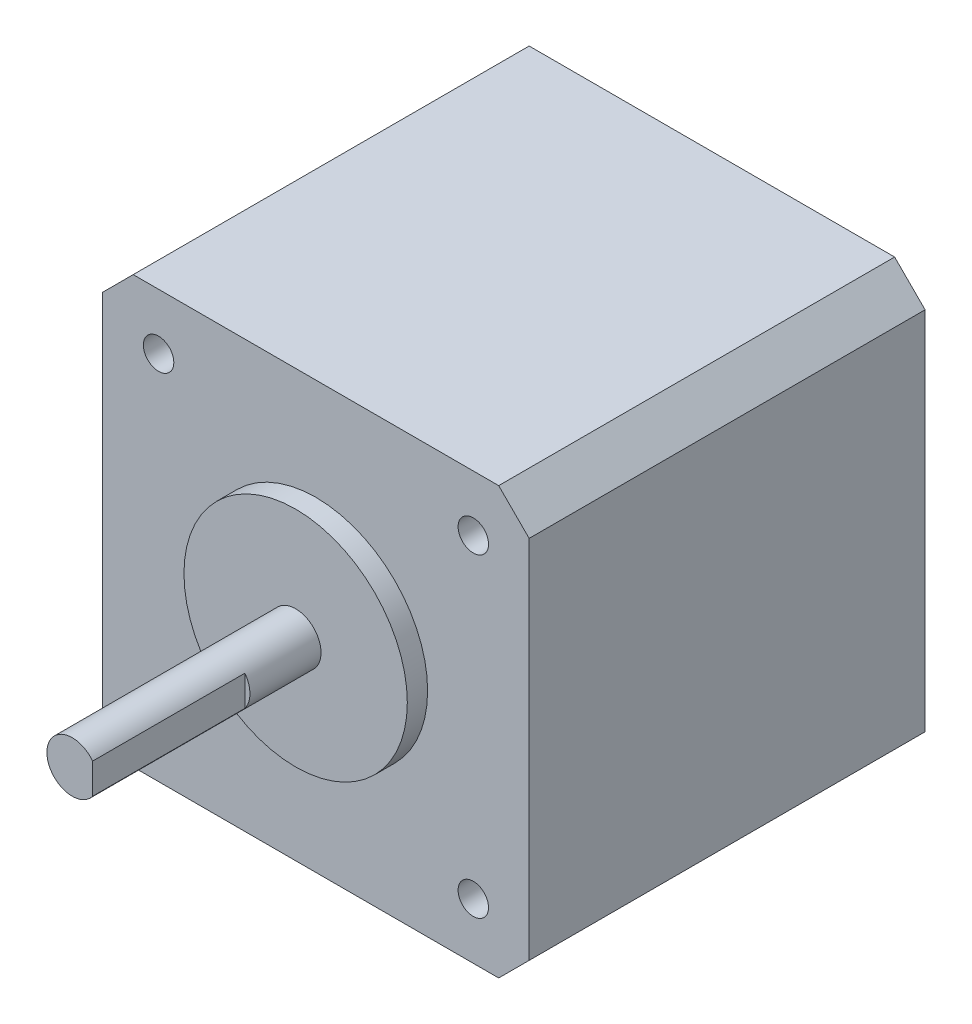
ISO-10303-21;
HEADER;
FILE_DESCRIPTION(('STEP AP214'),'2;1');
FILE_NAME('part.step','',(''),(''),'','','');
FILE_SCHEMA(('AUTOMOTIVE_DESIGN { 1 0 10303 214 1 1 1 1 }'));
ENDSEC;
DATA;
#1=APPLICATION_CONTEXT('core data for automotive mechanical design processes');
#2=APPLICATION_PROTOCOL_DEFINITION('international standard','automotive_design',2000,#1);
#3=PRODUCT_CONTEXT('',#1,'mechanical');
#4=PRODUCT('Part','Part','',(#3));
#5=PRODUCT_RELATED_PRODUCT_CATEGORY('part','',(#4));
#6=PRODUCT_DEFINITION_FORMATION('','',#4);
#7=PRODUCT_DEFINITION_CONTEXT('part definition',#1,'design');
#8=PRODUCT_DEFINITION('design','',#6,#7);
#9=PRODUCT_DEFINITION_SHAPE('','',#8);
#10=(LENGTH_UNIT() NAMED_UNIT(*) SI_UNIT(.MILLI.,.METRE.));
#11=(NAMED_UNIT(*) PLANE_ANGLE_UNIT() SI_UNIT($,.RADIAN.));
#12=(NAMED_UNIT(*) SI_UNIT($,.STERADIAN.) SOLID_ANGLE_UNIT());
#13=UNCERTAINTY_MEASURE_WITH_UNIT(LENGTH_MEASURE(1.E-05),#10,'distance_accuracy_value','');
#14=(GEOMETRIC_REPRESENTATION_CONTEXT(3) GLOBAL_UNCERTAINTY_ASSIGNED_CONTEXT((#13)) GLOBAL_UNIT_ASSIGNED_CONTEXT((#10,
#11,#12)) REPRESENTATION_CONTEXT('',''));
#15=CARTESIAN_POINT('',(0.,0.,0.));
#16=DIRECTION('',(0.,0.,1.));
#17=DIRECTION('',(1.,0.,0.));
#18=AXIS2_PLACEMENT_3D('',#15,#16,#17);
#19=CARTESIAN_POINT('',(21.,21.,63.));
#20=DIRECTION('',(0.,0.,-1.));
#21=DIRECTION('',(-1.,0.,0.));
#22=AXIS2_PLACEMENT_3D('',#19,#20,#21);
#23=CYLINDRICAL_SURFACE('',#22,2.5);
#24=CARTESIAN_POINT('',(21.,21.,41.));
#25=DIRECTION('',(0.,0.,1.));
#26=DIRECTION('',(1.,0.,0.));
#27=AXIS2_PLACEMENT_3D('',#24,#25,#26);
#28=CIRCLE('',#27,2.5);
#29=CARTESIAN_POINT('',(23.5,21.,41.));
#30=VERTEX_POINT('',#29);
#31=EDGE_CURVE('E156',#30,#30,#28,.T.);
#32=ORIENTED_EDGE('',*,*,#31,.T.);
#33=EDGE_LOOP('',(#32));
#34=FACE_BOUND('',#33,.T.);
#35=DIRECTION('',(0.,0.,-1.));
#36=VECTOR('',#35,1.);
#37=CARTESIAN_POINT('',(23.,19.5,249.981522672464));
#38=LINE('',#37,#36);
#39=CARTESIAN_POINT('',(23.,19.5,63.));
#40=VERTEX_POINT('',#39);
#41=CARTESIAN_POINT('',(23.,19.5,48.));
#42=VERTEX_POINT('',#41);
#43=EDGE_CURVE('E116',#40,#42,#38,.T.);
#44=ORIENTED_EDGE('',*,*,#43,.F.);
#45=CARTESIAN_POINT('',(21.,21.,63.));
#46=DIRECTION('',(0.,0.,1.));
#47=DIRECTION('',(1.,0.,0.));
#48=AXIS2_PLACEMENT_3D('',#45,#46,#47);
#49=CIRCLE('',#48,2.5);
#50=CARTESIAN_POINT('',(23.,22.5,63.));
#51=VERTEX_POINT('',#50);
#52=EDGE_CURVE('E151',#51,#40,#49,.T.);
#53=ORIENTED_EDGE('',*,*,#52,.F.);
#54=DIRECTION('',(0.,0.,-1.));
#55=VECTOR('',#54,1.);
#56=CARTESIAN_POINT('',(23.,22.5,249.981522672464));
#57=LINE('',#56,#55);
#58=CARTESIAN_POINT('',(23.,22.5,48.));
#59=VERTEX_POINT('',#58);
#60=EDGE_CURVE('E48',#51,#59,#57,.T.);
#61=ORIENTED_EDGE('',*,*,#60,.T.);
#62=CARTESIAN_POINT('',(21.,21.,48.));
#63=DIRECTION('',(0.,0.,1.));
#64=DIRECTION('',(1.,0.,0.));
#65=AXIS2_PLACEMENT_3D('',#62,#63,#64);
#66=CIRCLE('',#65,2.5);
#67=EDGE_CURVE('E115',#42,#59,#66,.T.);
#68=ORIENTED_EDGE('',*,*,#67,.F.);
#69=EDGE_LOOP('',(#44,#53,#61,#68));
#70=FACE_BOUND('',#69,.T.);
#71=ADVANCED_FACE('F33',(#34,#70),#23,.T.);
#72=CARTESIAN_POINT('',(21.,21.,63.));
#73=DIRECTION('',(0.,0.,1.));
#74=DIRECTION('',(1.,0.,0.));
#75=AXIS2_PLACEMENT_3D('',#72,#73,#74);
#76=PLANE('',#75);
#77=ORIENTED_EDGE('',*,*,#52,.T.);
#78=DIRECTION('',(0.,-1.,0.));
#79=VECTOR('',#78,1.);
#80=CARTESIAN_POINT('',(23.,22.5,63.));
#81=LINE('',#80,#79);
#82=EDGE_CURVE('E120',#51,#40,#81,.T.);
#83=ORIENTED_EDGE('',*,*,#82,.F.);
#84=EDGE_LOOP('',(#77,#83));
#85=FACE_BOUND('',#84,.T.);
#86=ADVANCED_FACE('F259',(#85),#76,.T.);
#87=CARTESIAN_POINT('',(0.,0.,39.));
#88=DIRECTION('',(1.,0.,0.));
#89=DIRECTION('',(0.,0.,-1.));
#90=AXIS2_PLACEMENT_3D('',#87,#88,#89);
#91=PLANE('',#90);
#92=DIRECTION('',(0.,-1.,0.));
#93=VECTOR('',#92,1.);
#94=CARTESIAN_POINT('',(0.,0.,0.));
#95=LINE('',#94,#93);
#96=CARTESIAN_POINT('',(0.,39.,0.));
#97=VERTEX_POINT('',#96);
#98=CARTESIAN_POINT('',(0.,3.00000000000001,0.));
#99=VERTEX_POINT('',#98);
#100=EDGE_CURVE('E163',#97,#99,#95,.T.);
#101=ORIENTED_EDGE('',*,*,#100,.T.);
#102=DIRECTION('',(0.,0.,1.));
#103=VECTOR('',#102,1.);
#104=CARTESIAN_POINT('',(0.,3.00000000000001,39.));
#105=LINE('',#104,#103);
#106=CARTESIAN_POINT('',(0.,3.00000000000001,39.));
#107=VERTEX_POINT('',#106);
#108=EDGE_CURVE('E202',#99,#107,#105,.T.);
#109=ORIENTED_EDGE('',*,*,#108,.T.);
#110=DIRECTION('',(0.,-1.,0.));
#111=VECTOR('',#110,1.);
#112=CARTESIAN_POINT('',(0.,0.,39.));
#113=LINE('',#112,#111);
#114=CARTESIAN_POINT('',(0.,39.,39.));
#115=VERTEX_POINT('',#114);
#116=EDGE_CURVE('E167',#115,#107,#113,.T.);
#117=ORIENTED_EDGE('',*,*,#116,.F.);
#118=DIRECTION('',(0.,0.,-1.));
#119=VECTOR('',#118,1.);
#120=CARTESIAN_POINT('',(0.,39.,39.));
#121=LINE('',#120,#119);
#122=EDGE_CURVE('E199',#115,#97,#121,.T.);
#123=ORIENTED_EDGE('',*,*,#122,.T.);
#124=EDGE_LOOP('',(#101,#109,#117,#123));
#125=FACE_BOUND('',#124,.T.);
#126=ADVANCED_FACE('F239',(#125),#91,.F.);
#127=CARTESIAN_POINT('',(0.,0.,39.));
#128=DIRECTION('',(0.,1.,0.));
#129=DIRECTION('',(0.,0.,1.));
#130=AXIS2_PLACEMENT_3D('',#127,#128,#129);
#131=PLANE('',#130);
#132=DIRECTION('',(1.,0.,0.));
#133=VECTOR('',#132,1.);
#134=CARTESIAN_POINT('',(0.,0.,39.));
#135=LINE('',#134,#133);
#136=CARTESIAN_POINT('',(3.,0.,39.));
#137=VERTEX_POINT('',#136);
#138=CARTESIAN_POINT('',(39.,0.,39.));
#139=VERTEX_POINT('',#138);
#140=EDGE_CURVE('E170',#137,#139,#135,.T.);
#141=ORIENTED_EDGE('',*,*,#140,.F.);
#142=DIRECTION('',(0.,0.,-1.));
#143=VECTOR('',#142,1.);
#144=CARTESIAN_POINT('',(3.,0.,39.));
#145=LINE('',#144,#143);
#146=CARTESIAN_POINT('',(3.,0.,0.));
#147=VERTEX_POINT('',#146);
#148=EDGE_CURVE('E188',#137,#147,#145,.T.);
#149=ORIENTED_EDGE('',*,*,#148,.T.);
#150=DIRECTION('',(1.,0.,0.));
#151=VECTOR('',#150,1.);
#152=CARTESIAN_POINT('',(0.,0.,0.));
#153=LINE('',#152,#151);
#154=CARTESIAN_POINT('',(39.,0.,0.));
#155=VERTEX_POINT('',#154);
#156=EDGE_CURVE('E180',#147,#155,#153,.T.);
#157=ORIENTED_EDGE('',*,*,#156,.T.);
#158=DIRECTION('',(0.,0.,1.));
#159=VECTOR('',#158,1.);
#160=CARTESIAN_POINT('',(39.,0.,39.));
#161=LINE('',#160,#159);
#162=EDGE_CURVE('E159',#155,#139,#161,.T.);
#163=ORIENTED_EDGE('',*,*,#162,.T.);
#164=EDGE_LOOP('',(#141,#149,#157,#163));
#165=FACE_BOUND('',#164,.T.);
#166=ADVANCED_FACE('F247',(#165),#131,.F.);
#167=CARTESIAN_POINT('',(42.,0.,39.));
#168=DIRECTION('',(-1.,0.,0.));
#169=DIRECTION('',(0.,0.,1.));
#170=AXIS2_PLACEMENT_3D('',#167,#168,#169);
#171=PLANE('',#170);
#172=DIRECTION('',(0.,1.,0.));
#173=VECTOR('',#172,1.);
#174=CARTESIAN_POINT('',(42.,0.,39.));
#175=LINE('',#174,#173);
#176=CARTESIAN_POINT('',(42.,3.,39.));
#177=VERTEX_POINT('',#176);
#178=CARTESIAN_POINT('',(42.,39.,39.));
#179=VERTEX_POINT('',#178);
#180=EDGE_CURVE('E174',#177,#179,#175,.T.);
#181=ORIENTED_EDGE('',*,*,#180,.F.);
#182=DIRECTION('',(0.,0.,-1.));
#183=VECTOR('',#182,1.);
#184=CARTESIAN_POINT('',(42.,3.,39.));
#185=LINE('',#184,#183);
#186=CARTESIAN_POINT('',(42.,3.,0.));
#187=VERTEX_POINT('',#186);
#188=EDGE_CURVE('E11',#177,#187,#185,.T.);
#189=ORIENTED_EDGE('',*,*,#188,.T.);
#190=DIRECTION('',(0.,1.,0.));
#191=VECTOR('',#190,1.);
#192=CARTESIAN_POINT('',(42.,0.,0.));
#193=LINE('',#192,#191);
#194=CARTESIAN_POINT('',(42.,39.,0.));
#195=VERTEX_POINT('',#194);
#196=EDGE_CURVE('E183',#187,#195,#193,.T.);
#197=ORIENTED_EDGE('',*,*,#196,.T.);
#198=DIRECTION('',(0.,0.,1.));
#199=VECTOR('',#198,1.);
#200=CARTESIAN_POINT('',(42.,39.,39.));
#201=LINE('',#200,#199);
#202=EDGE_CURVE('E41',#195,#179,#201,.T.);
#203=ORIENTED_EDGE('',*,*,#202,.T.);
#204=EDGE_LOOP('',(#181,#189,#197,#203));
#205=FACE_BOUND('',#204,.T.);
#206=ADVANCED_FACE('F218',(#205),#171,.F.);
#207=CARTESIAN_POINT('',(0.,42.,39.));
#208=DIRECTION('',(0.,-1.,0.));
#209=DIRECTION('',(0.,0.,-1.));
#210=AXIS2_PLACEMENT_3D('',#207,#208,#209);
#211=PLANE('',#210);
#212=DIRECTION('',(-1.,0.,0.));
#213=VECTOR('',#212,1.);
#214=CARTESIAN_POINT('',(0.,42.,0.));
#215=LINE('',#214,#213);
#216=CARTESIAN_POINT('',(39.,42.,0.));
#217=VERTEX_POINT('',#216);
#218=CARTESIAN_POINT('',(3.00000000000002,42.,0.));
#219=VERTEX_POINT('',#218);
#220=EDGE_CURVE('E171',#217,#219,#215,.T.);
#221=ORIENTED_EDGE('',*,*,#220,.T.);
#222=DIRECTION('',(0.,0.,1.));
#223=VECTOR('',#222,1.);
#224=CARTESIAN_POINT('',(3.00000000000002,42.,39.));
#225=LINE('',#224,#223);
#226=CARTESIAN_POINT('',(3.00000000000002,42.,39.));
#227=VERTEX_POINT('',#226);
#228=EDGE_CURVE('E56',#219,#227,#225,.T.);
#229=ORIENTED_EDGE('',*,*,#228,.T.);
#230=DIRECTION('',(-1.,0.,0.));
#231=VECTOR('',#230,1.);
#232=CARTESIAN_POINT('',(0.,42.,39.));
#233=LINE('',#232,#231);
#234=CARTESIAN_POINT('',(39.,42.,39.));
#235=VERTEX_POINT('',#234);
#236=EDGE_CURVE('E166',#235,#227,#233,.T.);
#237=ORIENTED_EDGE('',*,*,#236,.F.);
#238=DIRECTION('',(0.,0.,-1.));
#239=VECTOR('',#238,1.);
#240=CARTESIAN_POINT('',(39.,42.,39.));
#241=LINE('',#240,#239);
#242=EDGE_CURVE('E212',#235,#217,#241,.T.);
#243=ORIENTED_EDGE('',*,*,#242,.T.);
#244=EDGE_LOOP('',(#221,#229,#237,#243));
#245=FACE_BOUND('',#244,.T.);
#246=ADVANCED_FACE('F228',(#245),#211,.F.);
#247=CARTESIAN_POINT('',(0.,0.,39.));
#248=DIRECTION('',(0.,0.,-1.));
#249=DIRECTION('',(-1.,0.,0.));
#250=AXIS2_PLACEMENT_3D('',#247,#248,#249);
#251=PLANE('',#250);
#252=CARTESIAN_POINT('',(36.5,36.5,39.));
#253=DIRECTION('',(0.,0.,1.));
#254=DIRECTION('',(1.,0.,0.));
#255=AXIS2_PLACEMENT_3D('',#252,#253,#254);
#256=CIRCLE('',#255,1.5);
#257=CARTESIAN_POINT('',(38.,36.5,39.));
#258=VERTEX_POINT('',#257);
#259=EDGE_CURVE('E145',#258,#258,#256,.T.);
#260=ORIENTED_EDGE('',*,*,#259,.F.);
#261=EDGE_LOOP('',(#260));
#262=FACE_BOUND('',#261,.T.);
#263=CARTESIAN_POINT('',(36.5,5.5,39.));
#264=DIRECTION('',(0.,0.,1.));
#265=DIRECTION('',(1.,0.,0.));
#266=AXIS2_PLACEMENT_3D('',#263,#264,#265);
#267=CIRCLE('',#266,1.5);
#268=CARTESIAN_POINT('',(38.,5.5,39.));
#269=VERTEX_POINT('',#268);
#270=EDGE_CURVE('E139',#269,#269,#267,.T.);
#271=ORIENTED_EDGE('',*,*,#270,.F.);
#272=EDGE_LOOP('',(#271));
#273=FACE_BOUND('',#272,.T.);
#274=CARTESIAN_POINT('',(5.5,5.5,39.));
#275=DIRECTION('',(0.,0.,1.));
#276=DIRECTION('',(1.,0.,0.));
#277=AXIS2_PLACEMENT_3D('',#274,#275,#276);
#278=CIRCLE('',#277,1.5);
#279=CARTESIAN_POINT('',(7.,5.5,39.));
#280=VERTEX_POINT('',#279);
#281=EDGE_CURVE('E133',#280,#280,#278,.T.);
#282=ORIENTED_EDGE('',*,*,#281,.F.);
#283=EDGE_LOOP('',(#282));
#284=FACE_BOUND('',#283,.T.);
#285=CARTESIAN_POINT('',(5.5,36.5,39.));
#286=DIRECTION('',(0.,0.,1.));
#287=DIRECTION('',(1.,0.,0.));
#288=AXIS2_PLACEMENT_3D('',#285,#286,#287);
#289=CIRCLE('',#288,1.5);
#290=CARTESIAN_POINT('',(7.,36.5,39.));
#291=VERTEX_POINT('',#290);
#292=EDGE_CURVE('E132',#291,#291,#289,.T.);
#293=ORIENTED_EDGE('',*,*,#292,.F.);
#294=EDGE_LOOP('',(#293));
#295=FACE_BOUND('',#294,.T.);
#296=CARTESIAN_POINT('',(21.,21.,39.));
#297=DIRECTION('',(0.,0.,1.));
#298=DIRECTION('',(1.,0.,0.));
#299=AXIS2_PLACEMENT_3D('',#296,#297,#298);
#300=CIRCLE('',#299,11.);
#301=CARTESIAN_POINT('',(32.,21.,39.));
#302=VERTEX_POINT('',#301);
#303=EDGE_CURVE('E160',#302,#302,#300,.T.);
#304=ORIENTED_EDGE('',*,*,#303,.F.);
#305=EDGE_LOOP('',(#304));
#306=FACE_BOUND('',#305,.T.);
#307=ORIENTED_EDGE('',*,*,#116,.T.);
#308=DIRECTION('',(-0.707106781186547,0.707106781186548,0.));
#309=VECTOR('',#308,1.);
#310=CARTESIAN_POINT('',(3.,0.,39.));
#311=LINE('',#310,#309);
#312=EDGE_CURVE('E210',#107,#137,#311,.F.);
#313=ORIENTED_EDGE('',*,*,#312,.T.);
#314=ORIENTED_EDGE('',*,*,#140,.T.);
#315=DIRECTION('',(-0.707106781186548,-0.707106781186547,0.));
#316=VECTOR('',#315,1.);
#317=CARTESIAN_POINT('',(42.,3.,39.));
#318=LINE('',#317,#316);
#319=EDGE_CURVE('E206',#139,#177,#318,.F.);
#320=ORIENTED_EDGE('',*,*,#319,.T.);
#321=ORIENTED_EDGE('',*,*,#180,.T.);
#322=DIRECTION('',(0.707106781186546,-0.707106781186549,0.));
#323=VECTOR('',#322,1.);
#324=CARTESIAN_POINT('',(39.,42.,39.));
#325=LINE('',#324,#323);
#326=EDGE_CURVE('E204',#179,#235,#325,.F.);
#327=ORIENTED_EDGE('',*,*,#326,.T.);
#328=ORIENTED_EDGE('',*,*,#236,.T.);
#329=DIRECTION('',(0.707106781186549,0.707106781186546,0.));
#330=VECTOR('',#329,1.);
#331=CARTESIAN_POINT('',(0.,39.,39.));
#332=LINE('',#331,#330);
#333=EDGE_CURVE('E208',#227,#115,#332,.F.);
#334=ORIENTED_EDGE('',*,*,#333,.T.);
#335=EDGE_LOOP('',(#307,#313,#314,#320,#321,#327,#328,#334));
#336=FACE_BOUND('',#335,.T.);
#337=ADVANCED_FACE('F224',(#262,#273,#284,#295,#306,#336),#251,.F.);
#338=CARTESIAN_POINT('',(0.,0.,0.));
#339=DIRECTION('',(0.,0.,-1.));
#340=DIRECTION('',(-1.,0.,0.));
#341=AXIS2_PLACEMENT_3D('',#338,#339,#340);
#342=PLANE('',#341);
#343=ORIENTED_EDGE('',*,*,#156,.F.);
#344=DIRECTION('',(0.707106781186547,-0.707106781186548,0.));
#345=VECTOR('',#344,1.);
#346=CARTESIAN_POINT('',(1.5,1.5,0.));
#347=LINE('',#346,#345);
#348=EDGE_CURVE('E197',#147,#99,#347,.F.);
#349=ORIENTED_EDGE('',*,*,#348,.T.);
#350=ORIENTED_EDGE('',*,*,#100,.F.);
#351=DIRECTION('',(-0.707106781186549,-0.707106781186546,0.));
#352=VECTOR('',#351,1.);
#353=CARTESIAN_POINT('',(-19.5,19.5000000000001,0.));
#354=LINE('',#353,#352);
#355=EDGE_CURVE('E195',#97,#219,#354,.F.);
#356=ORIENTED_EDGE('',*,*,#355,.T.);
#357=ORIENTED_EDGE('',*,*,#220,.F.);
#358=DIRECTION('',(-0.707106781186546,0.707106781186549,0.));
#359=VECTOR('',#358,1.);
#360=CARTESIAN_POINT('',(40.5000000000001,40.4999999999999,0.));
#361=LINE('',#360,#359);
#362=EDGE_CURVE('E191',#217,#195,#361,.F.);
#363=ORIENTED_EDGE('',*,*,#362,.T.);
#364=ORIENTED_EDGE('',*,*,#196,.F.);
#365=DIRECTION('',(0.707106781186548,0.707106781186547,0.));
#366=VECTOR('',#365,1.);
#367=CARTESIAN_POINT('',(19.5,-19.5,0.));
#368=LINE('',#367,#366);
#369=EDGE_CURVE('E193',#187,#155,#368,.F.);
#370=ORIENTED_EDGE('',*,*,#369,.T.);
#371=EDGE_LOOP('',(#343,#349,#350,#356,#357,#363,#364,#370));
#372=FACE_BOUND('',#371,.T.);
#373=ADVANCED_FACE('F231',(#372),#342,.T.);
#374=CARTESIAN_POINT('',(21.,21.,41.));
#375=DIRECTION('',(0.,0.,-1.));
#376=DIRECTION('',(-1.,0.,0.));
#377=AXIS2_PLACEMENT_3D('',#374,#375,#376);
#378=CYLINDRICAL_SURFACE('',#377,11.);
#379=CARTESIAN_POINT('',(21.,21.,41.));
#380=DIRECTION('',(0.,0.,1.));
#381=DIRECTION('',(1.,0.,0.));
#382=AXIS2_PLACEMENT_3D('',#379,#380,#381);
#383=CIRCLE('',#382,11.);
#384=CARTESIAN_POINT('',(32.,21.,41.));
#385=VERTEX_POINT('',#384);
#386=EDGE_CURVE('E155',#385,#385,#383,.T.);
#387=ORIENTED_EDGE('',*,*,#386,.F.);
#388=EDGE_LOOP('',(#387));
#389=FACE_BOUND('',#388,.T.);
#390=ORIENTED_EDGE('',*,*,#303,.T.);
#391=EDGE_LOOP('',(#390));
#392=FACE_BOUND('',#391,.T.);
#393=ADVANCED_FACE('F273',(#389,#392),#378,.T.);
#394=CARTESIAN_POINT('',(21.,21.,41.));
#395=DIRECTION('',(0.,0.,1.));
#396=DIRECTION('',(1.,0.,0.));
#397=AXIS2_PLACEMENT_3D('',#394,#395,#396);
#398=PLANE('',#397);
#399=ORIENTED_EDGE('',*,*,#31,.F.);
#400=EDGE_LOOP('',(#399));
#401=FACE_BOUND('',#400,.T.);
#402=ORIENTED_EDGE('',*,*,#386,.T.);
#403=EDGE_LOOP('',(#402));
#404=FACE_BOUND('',#403,.T.);
#405=ADVANCED_FACE('F270',(#401,#404),#398,.T.);
#406=CARTESIAN_POINT('',(3.,0.,39.));
#407=DIRECTION('',(0.707106781186548,0.707106781186547,0.));
#408=DIRECTION('',(0.,0.,-1.));
#409=AXIS2_PLACEMENT_3D('',#406,#407,#408);
#410=PLANE('',#409);
#411=ORIENTED_EDGE('',*,*,#312,.F.);
#412=ORIENTED_EDGE('',*,*,#108,.F.);
#413=ORIENTED_EDGE('',*,*,#348,.F.);
#414=ORIENTED_EDGE('',*,*,#148,.F.);
#415=EDGE_LOOP('',(#411,#412,#413,#414));
#416=FACE_BOUND('',#415,.T.);
#417=ADVANCED_FACE('F245',(#416),#410,.F.);
#418=CARTESIAN_POINT('',(0.,39.,39.));
#419=DIRECTION('',(0.707106781186546,-0.707106781186549,0.));
#420=DIRECTION('',(0.,0.,-1.));
#421=AXIS2_PLACEMENT_3D('',#418,#419,#420);
#422=PLANE('',#421);
#423=ORIENTED_EDGE('',*,*,#333,.F.);
#424=ORIENTED_EDGE('',*,*,#228,.F.);
#425=ORIENTED_EDGE('',*,*,#355,.F.);
#426=ORIENTED_EDGE('',*,*,#122,.F.);
#427=EDGE_LOOP('',(#423,#424,#425,#426));
#428=FACE_BOUND('',#427,.T.);
#429=ADVANCED_FACE('F236',(#428),#422,.F.);
#430=CARTESIAN_POINT('',(42.,3.,39.));
#431=DIRECTION('',(-0.707106781186547,0.707106781186548,0.));
#432=DIRECTION('',(0.,0.,-1.));
#433=AXIS2_PLACEMENT_3D('',#430,#431,#432);
#434=PLANE('',#433);
#435=ORIENTED_EDGE('',*,*,#319,.F.);
#436=ORIENTED_EDGE('',*,*,#162,.F.);
#437=ORIENTED_EDGE('',*,*,#369,.F.);
#438=ORIENTED_EDGE('',*,*,#188,.F.);
#439=EDGE_LOOP('',(#435,#436,#437,#438));
#440=FACE_BOUND('',#439,.T.);
#441=ADVANCED_FACE('F250',(#440),#434,.F.);
#442=CARTESIAN_POINT('',(39.,42.,39.));
#443=DIRECTION('',(-0.707106781186549,-0.707106781186546,0.));
#444=DIRECTION('',(0.,0.,-1.));
#445=AXIS2_PLACEMENT_3D('',#442,#443,#444);
#446=PLANE('',#445);
#447=ORIENTED_EDGE('',*,*,#326,.F.);
#448=ORIENTED_EDGE('',*,*,#202,.F.);
#449=ORIENTED_EDGE('',*,*,#362,.F.);
#450=ORIENTED_EDGE('',*,*,#242,.F.);
#451=EDGE_LOOP('',(#447,#448,#449,#450));
#452=FACE_BOUND('',#451,.T.);
#453=ADVANCED_FACE('F35',(#452),#446,.F.);
#454=CARTESIAN_POINT('',(5.5,36.5,29.));
#455=DIRECTION('',(0.,0.,1.));
#456=DIRECTION('',(1.,0.,0.));
#457=AXIS2_PLACEMENT_3D('',#454,#455,#456);
#458=CYLINDRICAL_SURFACE('',#457,1.5);
#459=CARTESIAN_POINT('',(5.5,36.5,29.));
#460=DIRECTION('',(0.,0.,1.));
#461=DIRECTION('',(1.,0.,0.));
#462=AXIS2_PLACEMENT_3D('',#459,#460,#461);
#463=CIRCLE('',#462,1.5);
#464=CARTESIAN_POINT('',(7.,36.5,29.));
#465=VERTEX_POINT('',#464);
#466=EDGE_CURVE('E148',#465,#465,#463,.T.);
#467=ORIENTED_EDGE('',*,*,#466,.F.);
#468=EDGE_LOOP('',(#467));
#469=FACE_BOUND('',#468,.T.);
#470=ORIENTED_EDGE('',*,*,#292,.T.);
#471=EDGE_LOOP('',(#470));
#472=FACE_BOUND('',#471,.T.);
#473=ADVANCED_FACE('F256',(#469,#472),#458,.F.);
#474=CARTESIAN_POINT('',(5.5,36.5,29.));
#475=DIRECTION('',(0.,0.,1.));
#476=DIRECTION('',(1.,0.,0.));
#477=AXIS2_PLACEMENT_3D('',#474,#475,#476);
#478=PLANE('',#477);
#479=ORIENTED_EDGE('',*,*,#466,.T.);
#480=EDGE_LOOP('',(#479));
#481=FACE_BOUND('',#480,.T.);
#482=ADVANCED_FACE('F328',(#481),#478,.T.);
#483=CARTESIAN_POINT('',(5.5,5.5,29.));
#484=DIRECTION('',(0.,0.,1.));
#485=DIRECTION('',(1.,0.,0.));
#486=AXIS2_PLACEMENT_3D('',#483,#484,#485);
#487=CYLINDRICAL_SURFACE('',#486,1.5);
#488=CARTESIAN_POINT('',(5.5,5.5,29.));
#489=DIRECTION('',(0.,0.,1.));
#490=DIRECTION('',(1.,0.,0.));
#491=AXIS2_PLACEMENT_3D('',#488,#489,#490);
#492=CIRCLE('',#491,1.5);
#493=CARTESIAN_POINT('',(7.,5.5,29.));
#494=VERTEX_POINT('',#493);
#495=EDGE_CURVE('E129',#494,#494,#492,.T.);
#496=ORIENTED_EDGE('',*,*,#495,.F.);
#497=EDGE_LOOP('',(#496));
#498=FACE_BOUND('',#497,.T.);
#499=ORIENTED_EDGE('',*,*,#281,.T.);
#500=EDGE_LOOP('',(#499));
#501=FACE_BOUND('',#500,.T.);
#502=ADVANCED_FACE('F337',(#498,#501),#487,.F.);
#503=CARTESIAN_POINT('',(5.5,5.5,29.));
#504=DIRECTION('',(0.,0.,1.));
#505=DIRECTION('',(1.,0.,0.));
#506=AXIS2_PLACEMENT_3D('',#503,#504,#505);
#507=PLANE('',#506);
#508=ORIENTED_EDGE('',*,*,#495,.T.);
#509=EDGE_LOOP('',(#508));
#510=FACE_BOUND('',#509,.T.);
#511=ADVANCED_FACE('F347',(#510),#507,.T.);
#512=CARTESIAN_POINT('',(36.5,5.5,29.));
#513=DIRECTION('',(0.,0.,1.));
#514=DIRECTION('',(1.,0.,0.));
#515=AXIS2_PLACEMENT_3D('',#512,#513,#514);
#516=CYLINDRICAL_SURFACE('',#515,1.5);
#517=CARTESIAN_POINT('',(36.5,5.5,29.));
#518=DIRECTION('',(0.,0.,1.));
#519=DIRECTION('',(1.,0.,0.));
#520=AXIS2_PLACEMENT_3D('',#517,#518,#519);
#521=CIRCLE('',#520,1.5);
#522=CARTESIAN_POINT('',(38.,5.5,29.));
#523=VERTEX_POINT('',#522);
#524=EDGE_CURVE('E136',#523,#523,#521,.T.);
#525=ORIENTED_EDGE('',*,*,#524,.F.);
#526=EDGE_LOOP('',(#525));
#527=FACE_BOUND('',#526,.T.);
#528=ORIENTED_EDGE('',*,*,#270,.T.);
#529=EDGE_LOOP('',(#528));
#530=FACE_BOUND('',#529,.T.);
#531=ADVANCED_FACE('F357',(#527,#530),#516,.F.);
#532=CARTESIAN_POINT('',(36.5,5.5,29.));
#533=DIRECTION('',(0.,0.,1.));
#534=DIRECTION('',(1.,0.,0.));
#535=AXIS2_PLACEMENT_3D('',#532,#533,#534);
#536=PLANE('',#535);
#537=ORIENTED_EDGE('',*,*,#524,.T.);
#538=EDGE_LOOP('',(#537));
#539=FACE_BOUND('',#538,.T.);
#540=ADVANCED_FACE('F367',(#539),#536,.T.);
#541=CARTESIAN_POINT('',(36.5,36.5,29.));
#542=DIRECTION('',(0.,0.,1.));
#543=DIRECTION('',(1.,0.,0.));
#544=AXIS2_PLACEMENT_3D('',#541,#542,#543);
#545=CYLINDRICAL_SURFACE('',#544,1.5);
#546=CARTESIAN_POINT('',(36.5,36.5,29.));
#547=DIRECTION('',(0.,0.,1.));
#548=DIRECTION('',(1.,0.,0.));
#549=AXIS2_PLACEMENT_3D('',#546,#547,#548);
#550=CIRCLE('',#549,1.5);
#551=CARTESIAN_POINT('',(38.,36.5,29.));
#552=VERTEX_POINT('',#551);
#553=EDGE_CURVE('E142',#552,#552,#550,.T.);
#554=ORIENTED_EDGE('',*,*,#553,.F.);
#555=EDGE_LOOP('',(#554));
#556=FACE_BOUND('',#555,.T.);
#557=ORIENTED_EDGE('',*,*,#259,.T.);
#558=EDGE_LOOP('',(#557));
#559=FACE_BOUND('',#558,.T.);
#560=ADVANCED_FACE('F377',(#556,#559),#545,.F.);
#561=CARTESIAN_POINT('',(36.5,36.5,29.));
#562=DIRECTION('',(0.,0.,1.));
#563=DIRECTION('',(1.,0.,0.));
#564=AXIS2_PLACEMENT_3D('',#561,#562,#563);
#565=PLANE('',#564);
#566=ORIENTED_EDGE('',*,*,#553,.T.);
#567=EDGE_LOOP('',(#566));
#568=FACE_BOUND('',#567,.T.);
#569=ADVANCED_FACE('F386',(#568),#565,.T.);
#570=CARTESIAN_POINT('',(23.,22.5,249.981522672464));
#571=DIRECTION('',(1.,0.,0.));
#572=DIRECTION('',(0.,1.,0.));
#573=AXIS2_PLACEMENT_3D('',#570,#571,#572);
#574=PLANE('',#573);
#575=ORIENTED_EDGE('',*,*,#60,.F.);
#576=ORIENTED_EDGE('',*,*,#82,.T.);
#577=ORIENTED_EDGE('',*,*,#43,.T.);
#578=DIRECTION('',(0.,-1.,0.));
#579=VECTOR('',#578,1.);
#580=CARTESIAN_POINT('',(23.,22.5,48.));
#581=LINE('',#580,#579);
#582=EDGE_CURVE('E111',#59,#42,#581,.T.);
#583=ORIENTED_EDGE('',*,*,#582,.F.);
#584=EDGE_LOOP('',(#575,#576,#577,#583));
#585=FACE_BOUND('',#584,.T.);
#586=ADVANCED_FACE('F119',(#585),#574,.T.);
#587=CARTESIAN_POINT('',(21.,21.,48.));
#588=DIRECTION('',(0.,0.,1.));
#589=DIRECTION('',(1.,0.,0.));
#590=AXIS2_PLACEMENT_3D('',#587,#588,#589);
#591=PLANE('',#590);
#592=ORIENTED_EDGE('',*,*,#582,.T.);
#593=ORIENTED_EDGE('',*,*,#67,.T.);
#594=EDGE_LOOP('',(#592,#593));
#595=FACE_BOUND('',#594,.T.);
#596=ADVANCED_FACE('F113',(#595),#591,.T.);
#597=CLOSED_SHELL('',(#71,#86,#126,#166,#206,#246,#337,#373,#393,#405,#417,#429,#441,#453,#473,
#482,#502,#511,#531,#540,#560,#569,#586,#596));
#598=MANIFOLD_SOLID_BREP('B2',#597);
#599=ADVANCED_BREP_SHAPE_REPRESENTATION('',(#18,#598),#14);
#600=SHAPE_DEFINITION_REPRESENTATION(#9,#599);
ENDSEC;
END-ISO-10303-21;
